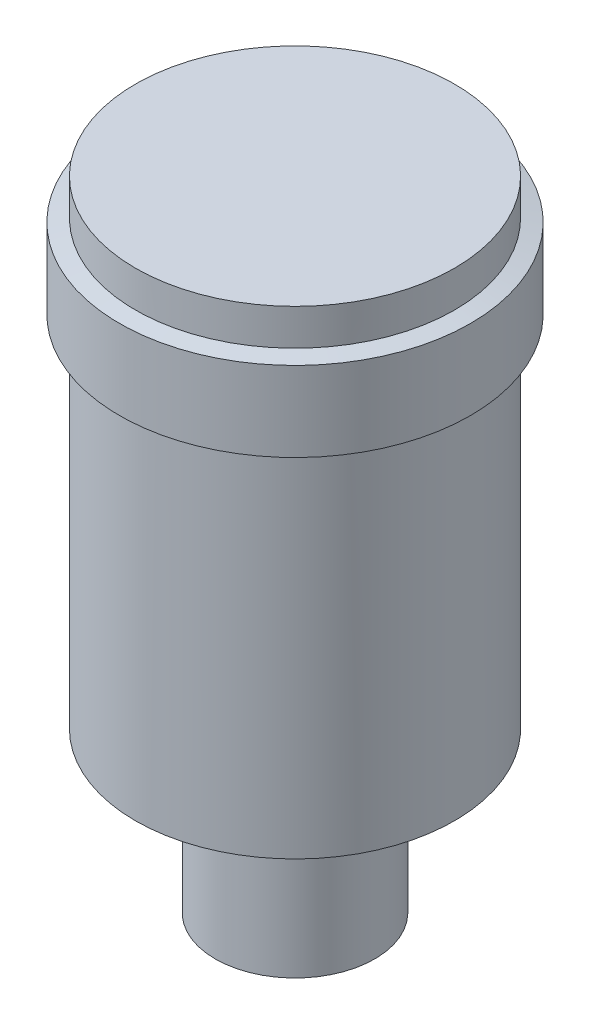
ISO-10303-21;
HEADER;
FILE_DESCRIPTION(('STEP AP214'),'2;1');
FILE_NAME('part.step','',(''),(''),'','','');
FILE_SCHEMA(('AUTOMOTIVE_DESIGN { 1 0 10303 214 1 1 1 1 }'));
ENDSEC;
DATA;
#1=APPLICATION_CONTEXT('core data for automotive mechanical design processes');
#2=APPLICATION_PROTOCOL_DEFINITION('international standard','automotive_design',2000,#1);
#3=PRODUCT_CONTEXT('',#1,'mechanical');
#4=PRODUCT('Part','Part','',(#3));
#5=PRODUCT_RELATED_PRODUCT_CATEGORY('part','',(#4));
#6=PRODUCT_DEFINITION_FORMATION('','',#4);
#7=PRODUCT_DEFINITION_CONTEXT('part definition',#1,'design');
#8=PRODUCT_DEFINITION('design','',#6,#7);
#9=PRODUCT_DEFINITION_SHAPE('','',#8);
#10=(LENGTH_UNIT() NAMED_UNIT(*) SI_UNIT(.MILLI.,.METRE.));
#11=(NAMED_UNIT(*) PLANE_ANGLE_UNIT() SI_UNIT($,.RADIAN.));
#12=(NAMED_UNIT(*) SI_UNIT($,.STERADIAN.) SOLID_ANGLE_UNIT());
#13=UNCERTAINTY_MEASURE_WITH_UNIT(LENGTH_MEASURE(1.E-05),#10,'distance_accuracy_value','');
#14=(GEOMETRIC_REPRESENTATION_CONTEXT(3) GLOBAL_UNCERTAINTY_ASSIGNED_CONTEXT((#13)) GLOBAL_UNIT_ASSIGNED_CONTEXT((#10,
#11,#12)) REPRESENTATION_CONTEXT('',''));
#15=CARTESIAN_POINT('',(0.,0.,0.));
#16=DIRECTION('',(0.,0.,1.));
#17=DIRECTION('',(1.,0.,0.));
#18=AXIS2_PLACEMENT_3D('',#15,#16,#17);
#19=CARTESIAN_POINT('',(0.,8.,0.));
#20=DIRECTION('',(0.,-1.,0.));
#21=DIRECTION('',(0.,0.,-1.));
#22=AXIS2_PLACEMENT_3D('',#19,#20,#21);
#23=CYLINDRICAL_SURFACE('',#22,2.);
#24=CARTESIAN_POINT('',(0.,2.,0.));
#25=DIRECTION('',(0.,1.,0.));
#26=DIRECTION('',(0.,0.,1.));
#27=AXIS2_PLACEMENT_3D('',#24,#25,#26);
#28=CIRCLE('',#27,2.);
#29=CARTESIAN_POINT('',(0.,2.,2.));
#30=VERTEX_POINT('',#29);
#31=EDGE_CURVE('E55',#30,#30,#28,.T.);
#32=ORIENTED_EDGE('',*,*,#31,.T.);
#33=EDGE_LOOP('',(#32));
#34=FACE_BOUND('',#33,.T.);
#35=CARTESIAN_POINT('',(0.,6.45454545454546,0.));
#36=DIRECTION('',(0.,1.,0.));
#37=DIRECTION('',(-1.,0.,0.));
#38=AXIS2_PLACEMENT_3D('',#35,#36,#37);
#39=CIRCLE('',#38,2.);
#40=CARTESIAN_POINT('',(-2.,6.45454545454546,0.));
#41=VERTEX_POINT('',#40);
#42=EDGE_CURVE('E41',#41,#41,#39,.T.);
#43=ORIENTED_EDGE('',*,*,#42,.F.);
#44=EDGE_LOOP('',(#43));
#45=FACE_BOUND('',#44,.T.);
#46=ADVANCED_FACE('F34',(#34,#45),#23,.T.);
#47=CARTESIAN_POINT('',(0.,2.,0.));
#48=DIRECTION('',(0.,-1.,0.));
#49=DIRECTION('',(0.,0.,-1.));
#50=AXIS2_PLACEMENT_3D('',#47,#48,#49);
#51=CYLINDRICAL_SURFACE('',#50,1.);
#52=CARTESIAN_POINT('',(0.,2.,0.));
#53=DIRECTION('',(0.,1.,0.));
#54=DIRECTION('',(0.,0.,1.));
#55=AXIS2_PLACEMENT_3D('',#52,#53,#54);
#56=CIRCLE('',#55,1.);
#57=CARTESIAN_POINT('',(0.,2.,1.));
#58=VERTEX_POINT('',#57);
#59=EDGE_CURVE('E58',#58,#58,#56,.T.);
#60=ORIENTED_EDGE('',*,*,#59,.F.);
#61=EDGE_LOOP('',(#60));
#62=FACE_BOUND('',#61,.T.);
#63=CARTESIAN_POINT('',(0.,0.,0.));
#64=DIRECTION('',(0.,1.,0.));
#65=DIRECTION('',(0.,0.,1.));
#66=AXIS2_PLACEMENT_3D('',#63,#64,#65);
#67=CIRCLE('',#66,1.);
#68=CARTESIAN_POINT('',(0.,0.,1.));
#69=VERTEX_POINT('',#68);
#70=EDGE_CURVE('E54',#69,#69,#67,.T.);
#71=ORIENTED_EDGE('',*,*,#70,.T.);
#72=EDGE_LOOP('',(#71));
#73=FACE_BOUND('',#72,.T.);
#74=ADVANCED_FACE('F36',(#62,#73),#51,.T.);
#75=CARTESIAN_POINT('',(0.,0.,0.));
#76=DIRECTION('',(0.,1.,0.));
#77=DIRECTION('',(0.,0.,1.));
#78=AXIS2_PLACEMENT_3D('',#75,#76,#77);
#79=PLANE('',#78);
#80=ORIENTED_EDGE('',*,*,#70,.F.);
#81=EDGE_LOOP('',(#80));
#82=FACE_BOUND('',#81,.T.);
#83=ADVANCED_FACE('F78',(#82),#79,.F.);
#84=CARTESIAN_POINT('',(0.,2.,0.));
#85=DIRECTION('',(0.,1.,0.));
#86=DIRECTION('',(0.,0.,1.));
#87=AXIS2_PLACEMENT_3D('',#84,#85,#86);
#88=PLANE('',#87);
#89=ORIENTED_EDGE('',*,*,#59,.T.);
#90=EDGE_LOOP('',(#89));
#91=FACE_BOUND('',#90,.T.);
#92=ORIENTED_EDGE('',*,*,#31,.F.);
#93=EDGE_LOOP('',(#92));
#94=FACE_BOUND('',#93,.T.);
#95=ADVANCED_FACE('F89',(#91,#94),#88,.F.);
#96=CARTESIAN_POINT('',(0.,7.5,0.));
#97=DIRECTION('',(0.,-1.,0.));
#98=DIRECTION('',(1.,0.,0.));
#99=AXIS2_PLACEMENT_3D('',#96,#97,#98);
#100=CONICAL_SURFACE('',#99,2.2,1.34731972565426);
#101=CARTESIAN_POINT('',(0.,7.5,0.));
#102=DIRECTION('',(0.,1.,0.));
#103=DIRECTION('',(-1.,0.,0.));
#104=AXIS2_PLACEMENT_3D('',#101,#102,#103);
#105=CIRCLE('',#104,2.2);
#106=CARTESIAN_POINT('',(-2.2,7.5,0.));
#107=VERTEX_POINT('',#106);
#108=EDGE_CURVE('E107',#107,#107,#105,.T.);
#109=ORIENTED_EDGE('',*,*,#108,.T.);
#110=EDGE_LOOP('',(#109));
#111=FACE_BOUND('',#110,.T.);
#112=CARTESIAN_POINT('',(0.,7.54545454545454,0.));
#113=DIRECTION('',(0.,-1.,0.));
#114=DIRECTION('',(1.,0.,0.));
#115=AXIS2_PLACEMENT_3D('',#112,#113,#114);
#116=CIRCLE('',#115,2.);
#117=CARTESIAN_POINT('',(2.,7.54545454545454,0.));
#118=VERTEX_POINT('',#117);
#119=EDGE_CURVE('E11',#118,#118,#116,.T.);
#120=ORIENTED_EDGE('',*,*,#119,.T.);
#121=EDGE_LOOP('',(#120));
#122=FACE_BOUND('',#121,.T.);
#123=ADVANCED_FACE('F87',(#111,#122),#100,.T.);
#124=CARTESIAN_POINT('',(0.,6.,0.));
#125=DIRECTION('',(0.,1.,0.));
#126=DIRECTION('',(-1.,0.,0.));
#127=AXIS2_PLACEMENT_3D('',#124,#125,#126);
#128=CONICAL_SURFACE('',#127,0.,1.34731972565426);
#129=CARTESIAN_POINT('',(0.,6.5,0.));
#130=DIRECTION('',(0.,1.,0.));
#131=DIRECTION('',(-1.,0.,0.));
#132=AXIS2_PLACEMENT_3D('',#129,#130,#131);
#133=CIRCLE('',#132,2.2);
#134=CARTESIAN_POINT('',(-2.2,6.5,0.));
#135=VERTEX_POINT('',#134);
#136=EDGE_CURVE('E61',#135,#135,#133,.T.);
#137=ORIENTED_EDGE('',*,*,#136,.F.);
#138=EDGE_LOOP('',(#137));
#139=FACE_BOUND('',#138,.T.);
#140=ORIENTED_EDGE('',*,*,#42,.T.);
#141=EDGE_LOOP('',(#140));
#142=FACE_BOUND('',#141,.T.);
#143=ADVANCED_FACE('F70',(#139,#142),#128,.T.);
#144=CARTESIAN_POINT('',(0.,8.,0.));
#145=DIRECTION('',(0.,1.,0.));
#146=DIRECTION('',(-1.,0.,0.));
#147=AXIS2_PLACEMENT_3D('',#144,#145,#146);
#148=CYLINDRICAL_SURFACE('',#147,2.2);
#149=ORIENTED_EDGE('',*,*,#108,.F.);
#150=EDGE_LOOP('',(#149));
#151=FACE_BOUND('',#150,.T.);
#152=ORIENTED_EDGE('',*,*,#136,.T.);
#153=EDGE_LOOP('',(#152));
#154=FACE_BOUND('',#153,.T.);
#155=ADVANCED_FACE('F48',(#151,#154),#148,.T.);
#156=CARTESIAN_POINT('',(0.,8.,0.));
#157=DIRECTION('',(0.,1.,0.));
#158=DIRECTION('',(0.,0.,1.));
#159=AXIS2_PLACEMENT_3D('',#156,#157,#158);
#160=PLANE('',#159);
#161=CARTESIAN_POINT('',(0.,8.,0.));
#162=VERTEX_POINT('',#161);
#163=VERTEX_LOOP('',#162);
#164=FACE_BOUND('',#163,.T.);
#165=CARTESIAN_POINT('',(0.,8.,0.));
#166=DIRECTION('',(0.,1.,0.));
#167=DIRECTION('',(0.,0.,1.));
#168=AXIS2_PLACEMENT_3D('',#165,#166,#167);
#169=CIRCLE('',#168,2.);
#170=CARTESIAN_POINT('',(0.,8.,2.));
#171=VERTEX_POINT('',#170);
#172=EDGE_CURVE('E52',#171,#171,#169,.T.);
#173=ORIENTED_EDGE('',*,*,#172,.T.);
#174=EDGE_LOOP('',(#173));
#175=FACE_BOUND('',#174,.T.);
#176=ADVANCED_FACE('F44',(#164,#175),#160,.T.);
#177=ORIENTED_EDGE('',*,*,#172,.F.);
#178=EDGE_LOOP('',(#177));
#179=FACE_BOUND('',#178,.T.);
#180=ORIENTED_EDGE('',*,*,#119,.F.);
#181=EDGE_LOOP('',(#180));
#182=FACE_BOUND('',#181,.T.);
#183=ADVANCED_FACE('F47',(#179,#182),#23,.T.);
#184=CLOSED_SHELL('',(#46,#74,#83,#95,#123,#143,#155,#176,#183));
#185=MANIFOLD_SOLID_BREP('B2',#184);
#186=ADVANCED_BREP_SHAPE_REPRESENTATION('',(#18,#185),#14);
#187=SHAPE_DEFINITION_REPRESENTATION(#9,#186);
ENDSEC;
END-ISO-10303-21;
